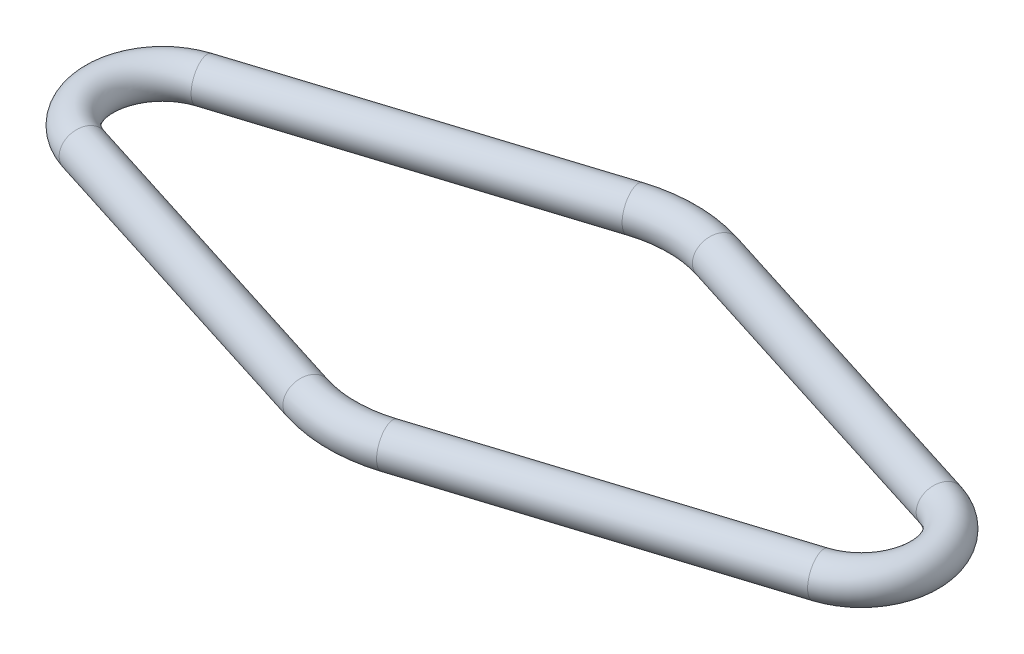
ISO-10303-21;
HEADER;
FILE_DESCRIPTION(('STEP AP214'),'2;1');
FILE_NAME('part.step','',(''),(''),'','','');
FILE_SCHEMA(('AUTOMOTIVE_DESIGN { 1 0 10303 214 1 1 1 1 }'));
ENDSEC;
DATA;
#1=APPLICATION_CONTEXT('core data for automotive mechanical design processes');
#2=APPLICATION_PROTOCOL_DEFINITION('international standard','automotive_design',2000,#1);
#3=PRODUCT_CONTEXT('',#1,'mechanical');
#4=PRODUCT('Part','Part','',(#3));
#5=PRODUCT_RELATED_PRODUCT_CATEGORY('part','',(#4));
#6=PRODUCT_DEFINITION_FORMATION('','',#4);
#7=PRODUCT_DEFINITION_CONTEXT('part definition',#1,'design');
#8=PRODUCT_DEFINITION('design','',#6,#7);
#9=PRODUCT_DEFINITION_SHAPE('','',#8);
#10=(LENGTH_UNIT() NAMED_UNIT(*) SI_UNIT(.MILLI.,.METRE.));
#11=(NAMED_UNIT(*) PLANE_ANGLE_UNIT() SI_UNIT($,.RADIAN.));
#12=(NAMED_UNIT(*) SI_UNIT($,.STERADIAN.) SOLID_ANGLE_UNIT());
#13=UNCERTAINTY_MEASURE_WITH_UNIT(LENGTH_MEASURE(1.E-05),#10,'distance_accuracy_value','');
#14=(GEOMETRIC_REPRESENTATION_CONTEXT(3) GLOBAL_UNCERTAINTY_ASSIGNED_CONTEXT((#13)) GLOBAL_UNIT_ASSIGNED_CONTEXT((#10,
#11,#12)) REPRESENTATION_CONTEXT('',''));
#15=CARTESIAN_POINT('',(0.,0.,0.));
#16=DIRECTION('',(0.,0.,1.));
#17=DIRECTION('',(1.,0.,0.));
#18=AXIS2_PLACEMENT_3D('',#15,#16,#17);
#19=CARTESIAN_POINT('',(-1.68984396552235,0.,6.75004542451107));
#20=DIRECTION('',(-0.953384602019686,0.,-0.301757850986124));
#21=DIRECTION('',(-0.301757850986124,0.,0.953384602019687));
#22=AXIS2_PLACEMENT_3D('',#19,#20,#21);
#23=CYLINDRICAL_SURFACE('',#22,0.8);
#24=CARTESIAN_POINT('',(-15.1845704125639,0.,2.47879996525119));
#25=DIRECTION('',(0.953384602019687,0.,0.301757850986124));
#26=DIRECTION('',(0.301757850986124,0.,-0.953384602019687));
#27=AXIS2_PLACEMENT_3D('',#24,#25,#26);
#28=CIRCLE('',#27,0.8);
#29=CARTESIAN_POINT('',(-15.4259766933528,0.,3.24150764686694));
#30=VERTEX_POINT('',#29);
#31=EDGE_CURVE('E41',#30,#30,#28,.T.);
#32=ORIENTED_EDGE('',*,*,#31,.T.);
#33=EDGE_LOOP('',(#32));
#34=FACE_BOUND('',#33,.T.);
#35=CARTESIAN_POINT('',(-1.68984396552235,0.,6.75004542451107));
#36=DIRECTION('',(0.953384602019687,0.,0.301757850986124));
#37=DIRECTION('',(0.301757850986124,0.,-0.953384602019687));
#38=AXIS2_PLACEMENT_3D('',#35,#36,#37);
#39=CIRCLE('',#38,0.8);
#40=CARTESIAN_POINT('',(-1.93125024631125,0.,7.51275310612682));
#41=VERTEX_POINT('',#40);
#42=EDGE_CURVE('E44',#41,#41,#39,.T.);
#43=ORIENTED_EDGE('',*,*,#42,.F.);
#44=EDGE_LOOP('',(#43));
#45=FACE_BOUND('',#44,.T.);
#46=ADVANCED_FACE('F15',(#34,#45),#23,.T.);
#47=CARTESIAN_POINT('',(-14.4,0.,0.));
#48=DIRECTION('',(0.,-1.,0.));
#49=DIRECTION('',(0.,0.,-1.));
#50=AXIS2_PLACEMENT_3D('',#47,#48,#49);
#51=TOROIDAL_SURFACE('',#50,2.6,0.8);
#52=CARTESIAN_POINT('',(-15.1845704125639,0.,-2.47879996525119));
#53=DIRECTION('',(-0.953384602019687,0.,0.301757850986124));
#54=DIRECTION('',(0.301757850986124,0.,0.953384602019687));
#55=AXIS2_PLACEMENT_3D('',#52,#53,#54);
#56=CIRCLE('',#55,0.8);
#57=CARTESIAN_POINT('',(-15.4259766933528,0.,-3.24150764686694));
#58=VERTEX_POINT('',#57);
#59=EDGE_CURVE('E38',#58,#58,#56,.T.);
#60=CARTESIAN_POINT('',(-14.4,0.,0.));
#61=DIRECTION('',(0.,-1.,0.));
#62=DIRECTION('',(0.,0.,-1.));
#63=AXIS2_PLACEMENT_3D('',#60,#61,#62);
#64=CIRCLE('',#63,3.4);
#65=EDGE_CURVE('',#30,#58,#64,.T.);
#66=ORIENTED_EDGE('',*,*,#31,.F.);
#67=ORIENTED_EDGE('',*,*,#59,.T.);
#68=ORIENTED_EDGE('',*,*,#65,.T.);
#69=ORIENTED_EDGE('',*,*,#65,.F.);
#70=EDGE_LOOP('',(#66,#68,#67,#69));
#71=FACE_BOUND('',#70,.T.);
#72=ADVANCED_FACE('F51',(#71),#51,.T.);
#73=CARTESIAN_POINT('',(-15.1845704125639,0.,-2.47879996525119));
#74=DIRECTION('',(0.953384602019686,0.,-0.301757850986124));
#75=DIRECTION('',(-0.301757850986124,0.,-0.953384602019687));
#76=AXIS2_PLACEMENT_3D('',#73,#74,#75);
#77=CYLINDRICAL_SURFACE('',#76,0.8);
#78=CARTESIAN_POINT('',(-1.68984396552235,0.,-6.75004542451107));
#79=DIRECTION('',(-0.953384602019687,0.,0.301757850986124));
#80=DIRECTION('',(0.301757850986124,0.,0.953384602019686));
#81=AXIS2_PLACEMENT_3D('',#78,#79,#80);
#82=CIRCLE('',#81,0.8);
#83=CARTESIAN_POINT('',(-1.93125024631125,0.,-7.51275310612682));
#84=VERTEX_POINT('',#83);
#85=EDGE_CURVE('E35',#84,#84,#82,.T.);
#86=CARTESIAN_POINT('',(-1.93125024631125,0.,-7.51275310612682));
#87=CARTESIAN_POINT('',(-2.07182031346793,0.,-7.4682609659262));
#88=CARTESIAN_POINT('',(-2.21239038062462,0.,-7.42376882572557));
#89=CARTESIAN_POINT('',(-2.49353051493798,0.,-7.33478454532433));
#90=CARTESIAN_POINT('',(-2.63410058209467,0.,-7.2902924051237));
#91=CARTESIAN_POINT('',(-2.91524071640803,0.,-7.20130812472245));
#92=CARTESIAN_POINT('',(-3.05581078356472,0.,-7.15681598452183));
#93=CARTESIAN_POINT('',(-3.33695091787808,0.,-7.06783170412058));
#94=CARTESIAN_POINT('',(-3.47752098503476,0.,-7.02333956391996));
#95=CARTESIAN_POINT('',(-3.75866111934813,0.,-6.93435528351871));
#96=CARTESIAN_POINT('',(-3.89923118650481,0.,-6.88986314331809));
#97=CARTESIAN_POINT('',(-4.18037132081818,0.,-6.80087886291684));
#98=CARTESIAN_POINT('',(-4.32094138797486,0.,-6.75638672271622));
#99=CARTESIAN_POINT('',(-4.60208152228823,0.,-6.66740244231497));
#100=CARTESIAN_POINT('',(-4.74265158944491,0.,-6.62291030211435));
#101=CARTESIAN_POINT('',(-5.02379172375828,0.,-6.5339260217131));
#102=CARTESIAN_POINT('',(-5.16436179091496,0.,-6.48943388151247));
#103=CARTESIAN_POINT('',(-5.44550192522833,0.,-6.40044960111123));
#104=CARTESIAN_POINT('',(-5.58607199238501,0.,-6.3559574609106));
#105=CARTESIAN_POINT('',(-5.86721212669838,0.,-6.26697318050935));
#106=CARTESIAN_POINT('',(-6.00778219385506,0.,-6.22248104030873));
#107=CARTESIAN_POINT('',(-6.28892232816843,0.,-6.13349675990748));
#108=CARTESIAN_POINT('',(-6.42949239532511,0.,-6.08900461970686));
#109=CARTESIAN_POINT('',(-6.71063252963848,0.,-6.00002033930561));
#110=CARTESIAN_POINT('',(-6.85120259679516,0.,-5.95552819910499));
#111=CARTESIAN_POINT('',(-7.13234273110853,0.,-5.86654391870374));
#112=CARTESIAN_POINT('',(-7.27291279826521,0.,-5.82205177850312));
#113=CARTESIAN_POINT('',(-7.55405293257857,0.,-5.73306749810187));
#114=CARTESIAN_POINT('',(-7.69462299973526,0.,-5.68857535790124));
#115=CARTESIAN_POINT('',(-7.97576313404862,0.,-5.5995910775));
#116=CARTESIAN_POINT('',(-8.1163332012053,0.,-5.55509893729937));
#117=CARTESIAN_POINT('',(-8.39747333551867,0.,-5.46611465689813));
#118=CARTESIAN_POINT('',(-8.53804340267535,0.,-5.4216225166975));
#119=CARTESIAN_POINT('',(-8.81918353698872,0.,-5.33263823629625));
#120=CARTESIAN_POINT('',(-8.9597536041454,0.,-5.28814609609563));
#121=CARTESIAN_POINT('',(-9.24089373845877,0.,-5.19916181569438));
#122=CARTESIAN_POINT('',(-9.38146380561545,0.,-5.15466967549376));
#123=CARTESIAN_POINT('',(-9.66260393992882,0.,-5.06568539509251));
#124=CARTESIAN_POINT('',(-9.8031740070855,0.,-5.02119325489189));
#125=CARTESIAN_POINT('',(-10.0843141413989,0.,-4.93220897449064));
#126=CARTESIAN_POINT('',(-10.2248842085556,0.,-4.88771683429002));
#127=CARTESIAN_POINT('',(-10.5060243428689,0.,-4.79873255388877));
#128=CARTESIAN_POINT('',(-10.6465944100256,0.,-4.75424041368814));
#129=CARTESIAN_POINT('',(-10.927734544339,0.,-4.6652561332869));
#130=CARTESIAN_POINT('',(-11.0683046114957,0.,-4.62076399308627));
#131=CARTESIAN_POINT('',(-11.349444745809,0.,-4.53177971268502));
#132=CARTESIAN_POINT('',(-11.4900148129657,0.,-4.4872875724844));
#133=CARTESIAN_POINT('',(-11.7711549472791,0.,-4.39830329208315));
#134=CARTESIAN_POINT('',(-11.9117250144357,0.,-4.35381115188253));
#135=CARTESIAN_POINT('',(-12.1928651487491,0.,-4.26482687148128));
#136=CARTESIAN_POINT('',(-12.3334352159058,0.,-4.22033473128066));
#137=CARTESIAN_POINT('',(-12.6145753502192,0.,-4.13135045087941));
#138=CARTESIAN_POINT('',(-12.7551454173758,0.,-4.08685831067879));
#139=CARTESIAN_POINT('',(-13.0362855516892,0.,-3.99787403027754));
#140=CARTESIAN_POINT('',(-13.1768556188459,0.,-3.95338189007692));
#141=CARTESIAN_POINT('',(-13.4579957531593,0.,-3.86439760967567));
#142=CARTESIAN_POINT('',(-13.5985658203159,0.,-3.81990546947504));
#143=CARTESIAN_POINT('',(-13.8797059546293,0.,-3.7309211890738));
#144=CARTESIAN_POINT('',(-14.020276021786,0.,-3.68642904887317));
#145=CARTESIAN_POINT('',(-14.3014161560994,0.,-3.59744476847193));
#146=CARTESIAN_POINT('',(-14.441986223256,0.,-3.5529526282713));
#147=CARTESIAN_POINT('',(-14.7231263575694,0.,-3.46396834787005));
#148=CARTESIAN_POINT('',(-14.8636964247261,0.,-3.41947620766943));
#149=CARTESIAN_POINT('',(-15.1448365590395,0.,-3.33049192726818));
#150=CARTESIAN_POINT('',(-15.2854066261961,0.,-3.28599978706756));
#151=CARTESIAN_POINT('',(-15.4259766933528,0.,-3.24150764686694));
#152=B_SPLINE_CURVE_WITH_KNOTS('',3,(#86,#87,#88,#89,#90,#91,#92,#93,#94,#95,#96,#97,#98,#99,
#100,#101,#102,#103,#104,#105,#106,#107,#108,#109,#110,#111,#112,#113,#114,#115,#116,#117,#118,
#119,#120,#121,#122,#123,#124,#125,#126,#127,#128,#129,#130,#131,#132,#133,#134,#135,#136,#137,
#138,#139,#140,#141,#142,#143,#144,#145,#146,#147,#148,#149,#150,#151),.UNSPECIFIED.,.F.,.F.,(4,
2,2,2,2,2,2,2,2,2,2,2,2,2,2,2,2,2,2,2,2,2,2,2,2,2,2,2,2,2,2,2,4),(0.,0.442329570434306,
0.884659140868611,1.32698871130292,1.76931828173722,2.21164785217153,2.65397742260583,
3.09630699304014,3.53863656347444,3.98096613390875,4.42329570434306,4.86562527477736,
5.30795484521167,5.75028441564597,6.19261398608027,6.63494355651458,7.07727312694889,
7.51960269738319,7.9619322678175,8.4042618382518,8.84659140868611,9.28892097912042,
9.73125054955472,10.173580119989,10.6159096904233,11.0582392608576,11.5005688312919,
11.9428984017262,12.3852279721606,12.8275575425949,13.2698871130292,13.7122166834635,
14.1545462538978),.UNSPECIFIED.);
#153=EDGE_CURVE('BSEAM59',#84,#58,#152,.T.);
#154=ORIENTED_EDGE('',*,*,#85,.T.);
#155=ORIENTED_EDGE('',*,*,#59,.F.);
#156=ORIENTED_EDGE('',*,*,#153,.T.);
#157=ORIENTED_EDGE('',*,*,#153,.F.);
#158=EDGE_LOOP('',(#154,#156,#155,#157));
#159=FACE_BOUND('',#158,.T.);
#160=ADVANCED_FACE('F59',(#159),#77,.T.);
#161=CARTESIAN_POINT('',(0.,0.,-1.41109165320067));
#162=DIRECTION('',(0.,-1.,0.));
#163=DIRECTION('',(0.,0.,-1.));
#164=AXIS2_PLACEMENT_3D('',#161,#162,#163);
#165=TOROIDAL_SURFACE('',#164,5.60000000000017,0.8);
#166=CARTESIAN_POINT('',(1.68984396552235,0.,-6.75004542451107));
#167=DIRECTION('',(-0.953384602019687,0.,-0.301757850986124));
#168=DIRECTION('',(-0.301757850986124,0.,0.953384602019686));
#169=AXIS2_PLACEMENT_3D('',#166,#167,#168);
#170=CIRCLE('',#169,0.8);
#171=CARTESIAN_POINT('',(1.93125024631125,0.,-7.51275310612682));
#172=VERTEX_POINT('',#171);
#173=EDGE_CURVE('E30',#172,#172,#170,.T.);
#174=CARTESIAN_POINT('',(0.,0.,-1.41109165320067));
#175=DIRECTION('',(0.,-1.,0.));
#176=DIRECTION('',(0.,0.,-1.));
#177=AXIS2_PLACEMENT_3D('',#174,#175,#176);
#178=CIRCLE('',#177,6.40000000000017);
#179=EDGE_CURVE('',#84,#172,#178,.T.);
#180=ORIENTED_EDGE('',*,*,#85,.F.);
#181=ORIENTED_EDGE('',*,*,#173,.T.);
#182=ORIENTED_EDGE('',*,*,#179,.T.);
#183=ORIENTED_EDGE('',*,*,#179,.F.);
#184=EDGE_LOOP('',(#180,#182,#181,#183));
#185=FACE_BOUND('',#184,.T.);
#186=ADVANCED_FACE('F65',(#185),#165,.T.);
#187=CARTESIAN_POINT('',(1.68984396552235,0.,-6.75004542451107));
#188=DIRECTION('',(0.953384602019686,0.,0.301757850986124));
#189=DIRECTION('',(0.301757850986124,0.,-0.953384602019687));
#190=AXIS2_PLACEMENT_3D('',#187,#188,#189);
#191=CYLINDRICAL_SURFACE('',#190,0.8);
#192=CARTESIAN_POINT('',(15.1845704125639,0.,-2.47879996525119));
#193=DIRECTION('',(-0.953384602019687,0.,-0.301757850986124));
#194=DIRECTION('',(-0.301757850986124,0.,0.953384602019687));
#195=AXIS2_PLACEMENT_3D('',#192,#193,#194);
#196=CIRCLE('',#195,0.8);
#197=CARTESIAN_POINT('',(15.4259766933528,0.,-3.24150764686694));
#198=VERTEX_POINT('',#197);
#199=EDGE_CURVE('E26',#198,#198,#196,.T.);
#200=ORIENTED_EDGE('',*,*,#199,.T.);
#201=EDGE_LOOP('',(#200));
#202=FACE_BOUND('',#201,.T.);
#203=ORIENTED_EDGE('',*,*,#173,.F.);
#204=EDGE_LOOP('',(#203));
#205=FACE_BOUND('',#204,.T.);
#206=ADVANCED_FACE('F69',(#202,#205),#191,.T.);
#207=CARTESIAN_POINT('',(14.4,0.,0.));
#208=DIRECTION('',(0.,-1.,0.));
#209=DIRECTION('',(0.,0.,-1.));
#210=AXIS2_PLACEMENT_3D('',#207,#208,#209);
#211=TOROIDAL_SURFACE('',#210,2.6,0.8);
#212=CARTESIAN_POINT('',(15.1845704125639,0.,2.47879996525119));
#213=DIRECTION('',(0.953384602019686,0.,-0.301757850986125));
#214=DIRECTION('',(-0.301757850986125,0.,-0.953384602019686));
#215=AXIS2_PLACEMENT_3D('',#212,#213,#214);
#216=CIRCLE('',#215,0.8);
#217=CARTESIAN_POINT('',(15.4259766933528,0.,3.24150764686694));
#218=VERTEX_POINT('',#217);
#219=EDGE_CURVE('E22',#218,#218,#216,.T.);
#220=CARTESIAN_POINT('',(14.4,0.,0.));
#221=DIRECTION('',(0.,-1.,0.));
#222=DIRECTION('',(0.,0.,-1.));
#223=AXIS2_PLACEMENT_3D('',#220,#221,#222);
#224=CIRCLE('',#223,3.4);
#225=EDGE_CURVE('',#198,#218,#224,.T.);
#226=ORIENTED_EDGE('',*,*,#199,.F.);
#227=ORIENTED_EDGE('',*,*,#219,.T.);
#228=ORIENTED_EDGE('',*,*,#225,.T.);
#229=ORIENTED_EDGE('',*,*,#225,.F.);
#230=EDGE_LOOP('',(#226,#228,#227,#229));
#231=FACE_BOUND('',#230,.T.);
#232=ADVANCED_FACE('F73',(#231),#211,.T.);
#233=CARTESIAN_POINT('',(15.1845704125639,0.,2.47879996525119));
#234=DIRECTION('',(-0.953384602019686,0.,0.301757850986124));
#235=DIRECTION('',(0.301757850986124,0.,0.953384602019687));
#236=AXIS2_PLACEMENT_3D('',#233,#234,#235);
#237=CYLINDRICAL_SURFACE('',#236,0.8);
#238=CARTESIAN_POINT('',(1.68984396552235,0.,6.75004542451107));
#239=DIRECTION('',(0.953384602019687,0.,-0.301757850986124));
#240=DIRECTION('',(-0.301757850986124,0.,-0.953384602019686));
#241=AXIS2_PLACEMENT_3D('',#238,#239,#240);
#242=CIRCLE('',#241,0.8);
#243=CARTESIAN_POINT('',(1.93125024631125,0.,7.51275310612682));
#244=VERTEX_POINT('',#243);
#245=EDGE_CURVE('E10',#244,#244,#242,.T.);
#246=CARTESIAN_POINT('',(1.93125024631125,0.,7.51275310612682));
#247=CARTESIAN_POINT('',(2.07182031346793,0.,7.4682609659262));
#248=CARTESIAN_POINT('',(2.21239038062462,0.,7.42376882572557));
#249=CARTESIAN_POINT('',(2.49353051493798,0.,7.33478454532433));
#250=CARTESIAN_POINT('',(2.63410058209467,0.,7.2902924051237));
#251=CARTESIAN_POINT('',(2.91524071640803,0.,7.20130812472245));
#252=CARTESIAN_POINT('',(3.05581078356472,0.,7.15681598452183));
#253=CARTESIAN_POINT('',(3.33695091787808,0.,7.06783170412058));
#254=CARTESIAN_POINT('',(3.47752098503476,0.,7.02333956391996));
#255=CARTESIAN_POINT('',(3.75866111934813,0.,6.93435528351871));
#256=CARTESIAN_POINT('',(3.89923118650481,0.,6.88986314331809));
#257=CARTESIAN_POINT('',(4.18037132081818,0.,6.80087886291684));
#258=CARTESIAN_POINT('',(4.32094138797486,0.,6.75638672271622));
#259=CARTESIAN_POINT('',(4.60208152228823,0.,6.66740244231497));
#260=CARTESIAN_POINT('',(4.74265158944491,0.,6.62291030211435));
#261=CARTESIAN_POINT('',(5.02379172375828,0.,6.5339260217131));
#262=CARTESIAN_POINT('',(5.16436179091496,0.,6.48943388151247));
#263=CARTESIAN_POINT('',(5.44550192522833,0.,6.40044960111123));
#264=CARTESIAN_POINT('',(5.58607199238501,0.,6.3559574609106));
#265=CARTESIAN_POINT('',(5.86721212669838,0.,6.26697318050935));
#266=CARTESIAN_POINT('',(6.00778219385506,0.,6.22248104030873));
#267=CARTESIAN_POINT('',(6.28892232816843,0.,6.13349675990748));
#268=CARTESIAN_POINT('',(6.42949239532511,0.,6.08900461970686));
#269=CARTESIAN_POINT('',(6.71063252963848,0.,6.00002033930561));
#270=CARTESIAN_POINT('',(6.85120259679516,0.,5.95552819910499));
#271=CARTESIAN_POINT('',(7.13234273110853,0.,5.86654391870374));
#272=CARTESIAN_POINT('',(7.27291279826521,0.,5.82205177850312));
#273=CARTESIAN_POINT('',(7.55405293257857,0.,5.73306749810187));
#274=CARTESIAN_POINT('',(7.69462299973526,0.,5.68857535790124));
#275=CARTESIAN_POINT('',(7.97576313404862,0.,5.5995910775));
#276=CARTESIAN_POINT('',(8.1163332012053,0.,5.55509893729937));
#277=CARTESIAN_POINT('',(8.39747333551867,0.,5.46611465689813));
#278=CARTESIAN_POINT('',(8.53804340267535,0.,5.4216225166975));
#279=CARTESIAN_POINT('',(8.81918353698872,0.,5.33263823629625));
#280=CARTESIAN_POINT('',(8.9597536041454,0.,5.28814609609563));
#281=CARTESIAN_POINT('',(9.24089373845877,0.,5.19916181569438));
#282=CARTESIAN_POINT('',(9.38146380561545,0.,5.15466967549376));
#283=CARTESIAN_POINT('',(9.66260393992882,0.,5.06568539509251));
#284=CARTESIAN_POINT('',(9.8031740070855,0.,5.02119325489189));
#285=CARTESIAN_POINT('',(10.0843141413989,0.,4.93220897449064));
#286=CARTESIAN_POINT('',(10.2248842085556,0.,4.88771683429002));
#287=CARTESIAN_POINT('',(10.5060243428689,0.,4.79873255388877));
#288=CARTESIAN_POINT('',(10.6465944100256,0.,4.75424041368814));
#289=CARTESIAN_POINT('',(10.927734544339,0.,4.6652561332869));
#290=CARTESIAN_POINT('',(11.0683046114957,0.,4.62076399308627));
#291=CARTESIAN_POINT('',(11.349444745809,0.,4.53177971268502));
#292=CARTESIAN_POINT('',(11.4900148129657,0.,4.4872875724844));
#293=CARTESIAN_POINT('',(11.7711549472791,0.,4.39830329208315));
#294=CARTESIAN_POINT('',(11.9117250144357,0.,4.35381115188253));
#295=CARTESIAN_POINT('',(12.1928651487491,0.,4.26482687148128));
#296=CARTESIAN_POINT('',(12.3334352159058,0.,4.22033473128066));
#297=CARTESIAN_POINT('',(12.6145753502192,0.,4.13135045087941));
#298=CARTESIAN_POINT('',(12.7551454173758,0.,4.08685831067879));
#299=CARTESIAN_POINT('',(13.0362855516892,0.,3.99787403027754));
#300=CARTESIAN_POINT('',(13.1768556188459,0.,3.95338189007692));
#301=CARTESIAN_POINT('',(13.4579957531593,0.,3.86439760967567));
#302=CARTESIAN_POINT('',(13.5985658203159,0.,3.81990546947504));
#303=CARTESIAN_POINT('',(13.8797059546293,0.,3.7309211890738));
#304=CARTESIAN_POINT('',(14.020276021786,0.,3.68642904887317));
#305=CARTESIAN_POINT('',(14.3014161560994,0.,3.59744476847193));
#306=CARTESIAN_POINT('',(14.441986223256,0.,3.5529526282713));
#307=CARTESIAN_POINT('',(14.7231263575694,0.,3.46396834787005));
#308=CARTESIAN_POINT('',(14.8636964247261,0.,3.41947620766943));
#309=CARTESIAN_POINT('',(15.1448365590395,0.,3.33049192726818));
#310=CARTESIAN_POINT('',(15.2854066261961,0.,3.28599978706756));
#311=CARTESIAN_POINT('',(15.4259766933528,0.,3.24150764686694));
#312=B_SPLINE_CURVE_WITH_KNOTS('',3,(#246,#247,#248,#249,#250,#251,#252,#253,#254,#255,#256,
#257,#258,#259,#260,#261,#262,#263,#264,#265,#266,#267,#268,#269,#270,#271,#272,#273,#274,#275,
#276,#277,#278,#279,#280,#281,#282,#283,#284,#285,#286,#287,#288,#289,#290,#291,#292,#293,#294,
#295,#296,#297,#298,#299,#300,#301,#302,#303,#304,#305,#306,#307,#308,#309,#310,#311),
.UNSPECIFIED.,.F.,.F.,(4,2,2,2,2,2,2,2,2,2,2,2,2,2,2,2,2,2,2,2,2,2,2,2,2,2,2,2,2,2,2,2,4),(0.,
0.442329570434306,0.884659140868611,1.32698871130292,1.76931828173722,2.21164785217153,
2.65397742260583,3.09630699304014,3.53863656347444,3.98096613390875,4.42329570434306,
4.86562527477736,5.30795484521167,5.75028441564597,6.19261398608027,6.63494355651458,
7.07727312694889,7.51960269738319,7.9619322678175,8.4042618382518,8.84659140868611,
9.28892097912042,9.73125054955472,10.173580119989,10.6159096904233,11.0582392608576,
11.5005688312919,11.9428984017262,12.3852279721606,12.8275575425949,13.2698871130292,
13.7122166834635,14.1545462538978),.UNSPECIFIED.);
#313=EDGE_CURVE('BSEAM76',#244,#218,#312,.T.);
#314=ORIENTED_EDGE('',*,*,#245,.T.);
#315=ORIENTED_EDGE('',*,*,#219,.F.);
#316=ORIENTED_EDGE('',*,*,#313,.T.);
#317=ORIENTED_EDGE('',*,*,#313,.F.);
#318=EDGE_LOOP('',(#314,#316,#315,#317));
#319=FACE_BOUND('',#318,.T.);
#320=ADVANCED_FACE('F76',(#319),#237,.T.);
#321=CARTESIAN_POINT('',(0.,0.,1.41109165320066));
#322=DIRECTION('',(0.,-1.,0.));
#323=DIRECTION('',(0.,0.,-1.));
#324=AXIS2_PLACEMENT_3D('',#321,#322,#323);
#325=TOROIDAL_SURFACE('',#324,5.60000000000017,0.8);
#326=CARTESIAN_POINT('',(0.,0.,1.41109165320066));
#327=DIRECTION('',(0.,-1.,0.));
#328=DIRECTION('',(0.,0.,-1.));
#329=AXIS2_PLACEMENT_3D('',#326,#327,#328);
#330=CIRCLE('',#329,6.40000000000017);
#331=EDGE_CURVE('',#244,#41,#330,.T.);
#332=ORIENTED_EDGE('',*,*,#245,.F.);
#333=ORIENTED_EDGE('',*,*,#42,.T.);
#334=ORIENTED_EDGE('',*,*,#331,.T.);
#335=ORIENTED_EDGE('',*,*,#331,.F.);
#336=EDGE_LOOP('',(#332,#334,#333,#335));
#337=FACE_BOUND('',#336,.T.);
#338=ADVANCED_FACE('F17',(#337),#325,.T.);
#339=CLOSED_SHELL('',(#46,#72,#160,#186,#206,#232,#320,#338));
#340=MANIFOLD_SOLID_BREP('B1',#339);
#341=ADVANCED_BREP_SHAPE_REPRESENTATION('',(#18,#340),#14);
#342=SHAPE_DEFINITION_REPRESENTATION(#9,#341);
ENDSEC;
END-ISO-10303-21;
